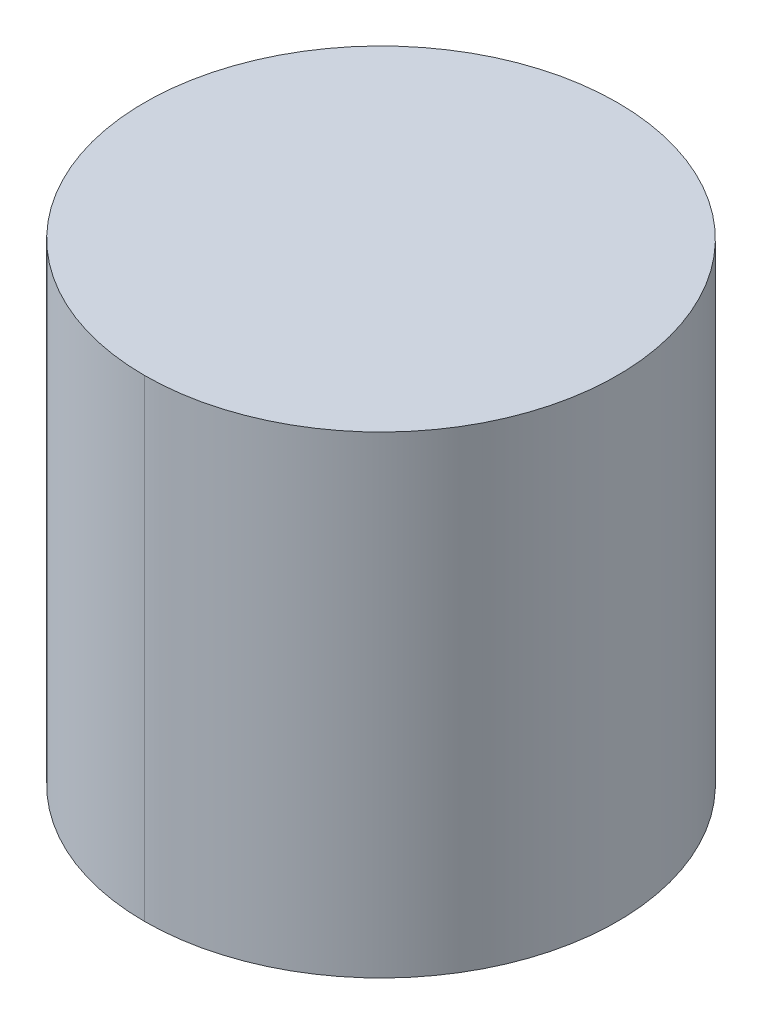
ISO-10303-21;
HEADER;
FILE_DESCRIPTION(('STEP AP214'),'2;1');
FILE_NAME('part.step','',(''),(''),'','','');
FILE_SCHEMA(('AUTOMOTIVE_DESIGN { 1 0 10303 214 1 1 1 1 }'));
ENDSEC;
DATA;
#1=APPLICATION_CONTEXT('core data for automotive mechanical design processes');
#2=APPLICATION_PROTOCOL_DEFINITION('international standard','automotive_design',2000,#1);
#3=PRODUCT_CONTEXT('',#1,'mechanical');
#4=PRODUCT('Part','Part','',(#3));
#5=PRODUCT_RELATED_PRODUCT_CATEGORY('part','',(#4));
#6=PRODUCT_DEFINITION_FORMATION('','',#4);
#7=PRODUCT_DEFINITION_CONTEXT('part definition',#1,'design');
#8=PRODUCT_DEFINITION('design','',#6,#7);
#9=PRODUCT_DEFINITION_SHAPE('','',#8);
#10=(LENGTH_UNIT() NAMED_UNIT(*) SI_UNIT(.MILLI.,.METRE.));
#11=(NAMED_UNIT(*) PLANE_ANGLE_UNIT() SI_UNIT($,.RADIAN.));
#12=(NAMED_UNIT(*) SI_UNIT($,.STERADIAN.) SOLID_ANGLE_UNIT());
#13=UNCERTAINTY_MEASURE_WITH_UNIT(LENGTH_MEASURE(1.E-05),#10,'distance_accuracy_value','');
#14=(GEOMETRIC_REPRESENTATION_CONTEXT(3) GLOBAL_UNCERTAINTY_ASSIGNED_CONTEXT((#13)) GLOBAL_UNIT_ASSIGNED_CONTEXT((#10,
#11,#12)) REPRESENTATION_CONTEXT('',''));
#15=CARTESIAN_POINT('',(0.,0.,0.));
#16=DIRECTION('',(0.,0.,1.));
#17=DIRECTION('',(1.,0.,0.));
#18=AXIS2_PLACEMENT_3D('',#15,#16,#17);
#19=CARTESIAN_POINT('',(0.,-3.175,0.));
#20=DIRECTION('',(0.,1.,0.));
#21=DIRECTION('',(1.,0.,0.));
#22=AXIS2_PLACEMENT_3D('',#19,#20,#21);
#23=PLANE('',#22);
#24=CARTESIAN_POINT('',(0.,-3.175,0.));
#25=DIRECTION('',(0.,1.,0.));
#26=DIRECTION('',(0.,0.,1.));
#27=AXIS2_PLACEMENT_3D('',#24,#25,#26);
#28=CIRCLE('',#27,3.175);
#29=CARTESIAN_POINT('',(0.,-3.175,-3.175));
#30=VERTEX_POINT('',#29);
#31=CARTESIAN_POINT('',(0.,-3.175,3.175));
#32=VERTEX_POINT('',#31);
#33=EDGE_CURVE('E10',#30,#32,#28,.T.);
#34=ORIENTED_EDGE('',*,*,#33,.F.);
#35=CARTESIAN_POINT('',(0.,-3.175,0.));
#36=DIRECTION('',(0.,1.,0.));
#37=DIRECTION('',(0.,0.,1.));
#38=AXIS2_PLACEMENT_3D('',#35,#36,#37);
#39=CIRCLE('',#38,3.175);
#40=EDGE_CURVE('E66',#32,#30,#39,.T.);
#41=ORIENTED_EDGE('',*,*,#40,.F.);
#42=EDGE_LOOP('',(#34,#41));
#43=FACE_BOUND('',#42,.T.);
#44=ADVANCED_FACE('F16',(#43),#23,.F.);
#45=CARTESIAN_POINT('',(0.,3.175,0.));
#46=DIRECTION('',(0.,1.,0.));
#47=DIRECTION('',(1.,0.,0.));
#48=AXIS2_PLACEMENT_3D('',#45,#46,#47);
#49=PLANE('',#48);
#50=CARTESIAN_POINT('',(0.,3.175,0.));
#51=DIRECTION('',(0.,1.,0.));
#52=DIRECTION('',(0.,0.,1.));
#53=AXIS2_PLACEMENT_3D('',#50,#51,#52);
#54=CIRCLE('',#53,3.175);
#55=CARTESIAN_POINT('',(0.,3.175,-3.175));
#56=VERTEX_POINT('',#55);
#57=CARTESIAN_POINT('',(0.,3.175,3.175));
#58=VERTEX_POINT('',#57);
#59=EDGE_CURVE('E20',#56,#58,#54,.T.);
#60=ORIENTED_EDGE('',*,*,#59,.T.);
#61=CARTESIAN_POINT('',(0.,3.175,0.));
#62=DIRECTION('',(0.,1.,0.));
#63=DIRECTION('',(0.,0.,1.));
#64=AXIS2_PLACEMENT_3D('',#61,#62,#63);
#65=CIRCLE('',#64,3.175);
#66=EDGE_CURVE('E56',#58,#56,#65,.T.);
#67=ORIENTED_EDGE('',*,*,#66,.T.);
#68=EDGE_LOOP('',(#60,#67));
#69=FACE_BOUND('',#68,.T.);
#70=ADVANCED_FACE('F18',(#69),#49,.T.);
#71=CARTESIAN_POINT('',(0.,3.175,0.));
#72=DIRECTION('',(0.,-1.,0.));
#73=DIRECTION('',(0.,0.,-1.));
#74=AXIS2_PLACEMENT_3D('',#71,#72,#73);
#75=CYLINDRICAL_SURFACE('',#74,3.175);
#76=DIRECTION('',(0.,-1.,0.));
#77=VECTOR('',#76,1.);
#78=CARTESIAN_POINT('',(0.,3.175,3.175));
#79=LINE('',#78,#77);
#80=EDGE_CURVE('E61',#58,#32,#79,.T.);
#81=ORIENTED_EDGE('',*,*,#80,.F.);
#82=ORIENTED_EDGE('',*,*,#59,.F.);
#83=DIRECTION('',(0.,-1.,0.));
#84=VECTOR('',#83,1.);
#85=CARTESIAN_POINT('',(0.,3.175,-3.175));
#86=LINE('',#85,#84);
#87=EDGE_CURVE('E59',#56,#30,#86,.T.);
#88=ORIENTED_EDGE('',*,*,#87,.T.);
#89=ORIENTED_EDGE('',*,*,#33,.T.);
#90=EDGE_LOOP('',(#81,#82,#88,#89));
#91=FACE_BOUND('',#90,.T.);
#92=ADVANCED_FACE('F62',(#91),#75,.T.);
#93=CARTESIAN_POINT('',(0.,3.175,0.));
#94=DIRECTION('',(0.,-1.,0.));
#95=DIRECTION('',(0.,0.,-1.));
#96=AXIS2_PLACEMENT_3D('',#93,#94,#95);
#97=CYLINDRICAL_SURFACE('',#96,3.175);
#98=ORIENTED_EDGE('',*,*,#66,.F.);
#99=ORIENTED_EDGE('',*,*,#80,.T.);
#100=ORIENTED_EDGE('',*,*,#40,.T.);
#101=ORIENTED_EDGE('',*,*,#87,.F.);
#102=EDGE_LOOP('',(#98,#99,#100,#101));
#103=FACE_BOUND('',#102,.T.);
#104=ADVANCED_FACE('F68',(#103),#97,.T.);
#105=CLOSED_SHELL('',(#44,#70,#92,#104));
#106=MANIFOLD_SOLID_BREP('B1',#105);
#107=ADVANCED_BREP_SHAPE_REPRESENTATION('',(#18,#106),#14);
#108=SHAPE_DEFINITION_REPRESENTATION(#9,#107);
ENDSEC;
END-ISO-10303-21;
